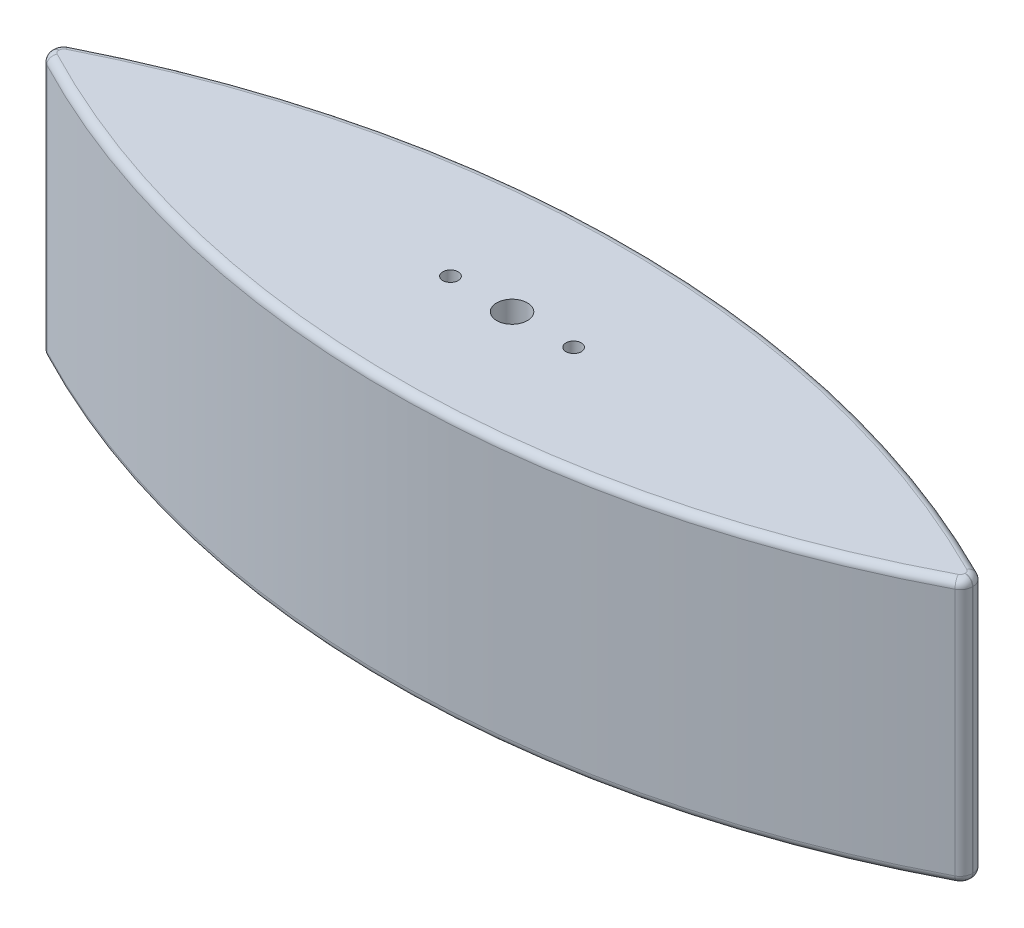
ISO-10303-21;
HEADER;
FILE_DESCRIPTION(('STEP AP214'),'2;1');
FILE_NAME('part.step','',(''),(''),'','','');
FILE_SCHEMA(('AUTOMOTIVE_DESIGN { 1 0 10303 214 1 1 1 1 }'));
ENDSEC;
DATA;
#1=APPLICATION_CONTEXT('core data for automotive mechanical design processes');
#2=APPLICATION_PROTOCOL_DEFINITION('international standard','automotive_design',2000,#1);
#3=PRODUCT_CONTEXT('',#1,'mechanical');
#4=PRODUCT('Part','Part','',(#3));
#5=PRODUCT_RELATED_PRODUCT_CATEGORY('part','',(#4));
#6=PRODUCT_DEFINITION_FORMATION('','',#4);
#7=PRODUCT_DEFINITION_CONTEXT('part definition',#1,'design');
#8=PRODUCT_DEFINITION('design','',#6,#7);
#9=PRODUCT_DEFINITION_SHAPE('','',#8);
#10=(LENGTH_UNIT() NAMED_UNIT(*) SI_UNIT(.MILLI.,.METRE.));
#11=(NAMED_UNIT(*) PLANE_ANGLE_UNIT() SI_UNIT($,.RADIAN.));
#12=(NAMED_UNIT(*) SI_UNIT($,.STERADIAN.) SOLID_ANGLE_UNIT());
#13=UNCERTAINTY_MEASURE_WITH_UNIT(LENGTH_MEASURE(1.E-05),#10,'distance_accuracy_value','');
#14=(GEOMETRIC_REPRESENTATION_CONTEXT(3) GLOBAL_UNCERTAINTY_ASSIGNED_CONTEXT((#13)) GLOBAL_UNIT_ASSIGNED_CONTEXT((#10,
#11,#12)) REPRESENTATION_CONTEXT('',''));
#15=CARTESIAN_POINT('',(0.,0.,0.));
#16=DIRECTION('',(0.,0.,1.));
#17=DIRECTION('',(1.,0.,0.));
#18=AXIS2_PLACEMENT_3D('',#15,#16,#17);
#19=CARTESIAN_POINT('',(0.,165.143069561917,-28.575));
#20=DIRECTION('',(-1.,0.,0.));
#21=DIRECTION('',(0.,0.,1.));
#22=AXIS2_PLACEMENT_3D('',#19,#20,#21);
#23=PLANE('',#22);
#24=DIRECTION('',(0.,1.,0.));
#25=VECTOR('',#24,1.);
#26=CARTESIAN_POINT('',(0.,165.143069561917,-0.0274618653671177));
#27=LINE('',#26,#25);
#28=CARTESIAN_POINT('',(0.,217.939571839068,-0.0274618653671177));
#29=VERTEX_POINT('',#28);
#30=CARTESIAN_POINT('',(0.,166.730569561916,-0.0274618653671177));
#31=VERTEX_POINT('',#30);
#32=EDGE_CURVE('E175',#29,#31,#27,.F.);
#33=ORIENTED_EDGE('',*,*,#32,.T.);
#34=DIRECTION('',(0.,0.,1.));
#35=VECTOR('',#34,1.);
#36=CARTESIAN_POINT('',(0.,166.730569561916,-28.575));
#37=LINE('',#36,#35);
#38=CARTESIAN_POINT('',(0.,166.730569561916,0.0551432731966117));
#39=VERTEX_POINT('',#38);
#40=EDGE_CURVE('E201',#31,#39,#37,.T.);
#41=ORIENTED_EDGE('',*,*,#40,.T.);
#42=DIRECTION('',(0.,1.,0.));
#43=VECTOR('',#42,1.);
#44=CARTESIAN_POINT('',(0.,165.143069561917,0.0551432731966117));
#45=LINE('',#44,#43);
#46=CARTESIAN_POINT('',(0.,217.939571839068,0.0551432731966117));
#47=VERTEX_POINT('',#46);
#48=EDGE_CURVE('E178',#39,#47,#45,.T.);
#49=ORIENTED_EDGE('',*,*,#48,.T.);
#50=DIRECTION('',(0.,0.,1.));
#51=VECTOR('',#50,1.);
#52=CARTESIAN_POINT('',(0.,217.939571839068,-28.575));
#53=LINE('',#52,#51);
#54=EDGE_CURVE('E199',#47,#29,#53,.F.);
#55=ORIENTED_EDGE('',*,*,#54,.T.);
#56=EDGE_LOOP('',(#33,#41,#49,#55));
#57=FACE_BOUND('',#56,.T.);
#58=ADVANCED_FACE('F35',(#57),#23,.T.);
#59=CARTESIAN_POINT('',(0.,219.527071839068,-28.575));
#60=DIRECTION('',(0.,1.,0.));
#61=DIRECTION('',(0.,0.,1.));
#62=AXIS2_PLACEMENT_3D('',#59,#60,#61);
#63=PLANE('',#62);
#64=CARTESIAN_POINT('',(82.3249515817493,219.527071839068,0.));
#65=DIRECTION('',(0.,1.,0.));
#66=DIRECTION('',(0.,0.,1.));
#67=AXIS2_PLACEMENT_3D('',#64,#65,#66);
#68=CIRCLE('',#67,1.5875);
#69=CARTESIAN_POINT('',(82.3249515817493,219.527071839068,1.58749999999999));
#70=VERTEX_POINT('',#69);
#71=EDGE_CURVE('E684',#70,#70,#68,.T.);
#72=ORIENTED_EDGE('',*,*,#71,.F.);
#73=EDGE_LOOP('',(#72));
#74=FACE_BOUND('',#73,.T.);
#75=CARTESIAN_POINT('',(107.724951581749,219.527071839068,0.));
#76=DIRECTION('',(0.,1.,0.));
#77=DIRECTION('',(0.,0.,1.));
#78=AXIS2_PLACEMENT_3D('',#75,#76,#77);
#79=CIRCLE('',#78,1.5875);
#80=CARTESIAN_POINT('',(107.724951581749,219.527071839068,1.58749999999999));
#81=VERTEX_POINT('',#80);
#82=EDGE_CURVE('E693',#81,#81,#79,.T.);
#83=ORIENTED_EDGE('',*,*,#82,.F.);
#84=EDGE_LOOP('',(#83));
#85=FACE_BOUND('',#84,.T.);
#86=DIRECTION('',(0.,0.,1.));
#87=VECTOR('',#86,1.);
#88=CARTESIAN_POINT('',(1.5875,219.527071839068,-28.575));
#89=LINE('',#88,#87);
#90=CARTESIAN_POINT('',(1.5875,219.527071839068,-0.0274618653671177));
#91=VERTEX_POINT('',#90);
#92=CARTESIAN_POINT('',(1.5875,219.527071839068,0.0551432731966117));
#93=VERTEX_POINT('',#92);
#94=EDGE_CURVE('E52',#91,#93,#89,.T.);
#95=ORIENTED_EDGE('',*,*,#94,.T.);
#96=CARTESIAN_POINT('',(2.54,219.527071839068,0.0551432731966117));
#97=DIRECTION('',(0.,1.,0.));
#98=DIRECTION('',(0.,0.,1.));
#99=AXIS2_PLACEMENT_3D('',#96,#97,#98);
#100=CIRCLE('',#99,0.9525);
#101=CARTESIAN_POINT('',(2.09905482923774,219.527071839068,0.899432090119732));
#102=VERTEX_POINT('',#101);
#103=EDGE_CURVE('E234',#93,#102,#100,.T.);
#104=ORIENTED_EDGE('',*,*,#103,.T.);
#105=CARTESIAN_POINT('',(95.0249515817493,219.527071839068,-177.028121340325));
#106=DIRECTION('',(0.,1.,0.));
#107=DIRECTION('',(0.,0.,1.));
#108=AXIS2_PLACEMENT_3D('',#105,#106,#107);
#109=CIRCLE('',#108,200.732250914003);
#110=CARTESIAN_POINT('',(187.950848334261,219.527071839068,0.899432090119741));
#111=VERTEX_POINT('',#110);
#112=EDGE_CURVE('E222',#102,#111,#109,.T.);
#113=ORIENTED_EDGE('',*,*,#112,.T.);
#114=CARTESIAN_POINT('',(187.509903163499,219.527071839068,0.0551432731966117));
#115=DIRECTION('',(0.,1.,0.));
#116=DIRECTION('',(0.,0.,1.));
#117=AXIS2_PLACEMENT_3D('',#114,#115,#116);
#118=CIRCLE('',#117,0.9525);
#119=CARTESIAN_POINT('',(188.462403163499,219.527071839068,0.0551432731966117));
#120=VERTEX_POINT('',#119);
#121=EDGE_CURVE('E224',#111,#120,#118,.T.);
#122=ORIENTED_EDGE('',*,*,#121,.T.);
#123=DIRECTION('',(0.,0.,1.));
#124=VECTOR('',#123,1.);
#125=CARTESIAN_POINT('',(188.462403163499,219.527071839068,-28.575));
#126=LINE('',#125,#124);
#127=CARTESIAN_POINT('',(188.462403163499,219.527071839068,-0.0274618653671177));
#128=VERTEX_POINT('',#127);
#129=EDGE_CURVE('E226',#120,#128,#126,.F.);
#130=ORIENTED_EDGE('',*,*,#129,.T.);
#131=CARTESIAN_POINT('',(187.509903163499,219.527071839068,-0.0274618653671177));
#132=DIRECTION('',(0.,1.,0.));
#133=DIRECTION('',(0.,0.,1.));
#134=AXIS2_PLACEMENT_3D('',#131,#132,#133);
#135=CIRCLE('',#134,0.9525);
#136=CARTESIAN_POINT('',(187.93740809999,219.527071839068,-0.878635043560588));
#137=VERTEX_POINT('',#136);
#138=EDGE_CURVE('E228',#128,#137,#135,.T.);
#139=ORIENTED_EDGE('',*,*,#138,.T.);
#140=CARTESIAN_POINT('',(95.0249515817493,219.527071839068,184.11242390785));
#141=DIRECTION('',(0.,1.,0.));
#142=DIRECTION('',(0.,0.,1.));
#143=AXIS2_PLACEMENT_3D('',#140,#141,#142);
#144=CIRCLE('',#143,207.013082843134);
#145=CARTESIAN_POINT('',(2.11249506350918,219.527071839068,-0.87863504356059));
#146=VERTEX_POINT('',#145);
#147=EDGE_CURVE('E230',#137,#146,#144,.T.);
#148=ORIENTED_EDGE('',*,*,#147,.T.);
#149=CARTESIAN_POINT('',(2.54,219.527071839068,-0.0274618653671177));
#150=DIRECTION('',(0.,1.,0.));
#151=DIRECTION('',(0.,0.,1.));
#152=AXIS2_PLACEMENT_3D('',#149,#150,#151);
#153=CIRCLE('',#152,0.9525);
#154=EDGE_CURVE('E57',#146,#91,#153,.T.);
#155=ORIENTED_EDGE('',*,*,#154,.T.);
#156=EDGE_LOOP('',(#95,#104,#113,#122,#130,#139,#148,#155));
#157=FACE_BOUND('',#156,.T.);
#158=CARTESIAN_POINT('',(95.0249515817493,219.527071839068,0.));
#159=DIRECTION('',(0.,1.,0.));
#160=DIRECTION('',(0.,0.,1.));
#161=AXIS2_PLACEMENT_3D('',#158,#159,#160);
#162=CIRCLE('',#161,3.175);
#163=CARTESIAN_POINT('',(95.0249515817493,219.527071839068,3.17499999999999));
#164=VERTEX_POINT('',#163);
#165=EDGE_CURVE('E252',#164,#164,#162,.T.);
#166=ORIENTED_EDGE('',*,*,#165,.F.);
#167=EDGE_LOOP('',(#166));
#168=FACE_BOUND('',#167,.T.);
#169=ADVANCED_FACE('F357',(#74,#85,#157,#168),#63,.T.);
#170=CARTESIAN_POINT('',(190.049903163499,165.143069561917,-28.575));
#171=DIRECTION('',(1.,0.,0.));
#172=DIRECTION('',(0.,0.,-1.));
#173=AXIS2_PLACEMENT_3D('',#170,#171,#172);
#174=PLANE('',#173);
#175=DIRECTION('',(0.,1.,0.));
#176=VECTOR('',#175,1.);
#177=CARTESIAN_POINT('',(190.049903163499,165.143069561917,0.0551432731966117));
#178=LINE('',#177,#176);
#179=CARTESIAN_POINT('',(190.049903163499,217.939571839068,0.0551432731966117));
#180=VERTEX_POINT('',#179);
#181=CARTESIAN_POINT('',(190.049903163499,166.730569561916,0.0551432731966117));
#182=VERTEX_POINT('',#181);
#183=EDGE_CURVE('E300',#180,#182,#178,.F.);
#184=ORIENTED_EDGE('',*,*,#183,.T.);
#185=DIRECTION('',(0.,0.,1.));
#186=VECTOR('',#185,1.);
#187=CARTESIAN_POINT('',(190.049903163499,166.730569561916,-28.575));
#188=LINE('',#187,#186);
#189=CARTESIAN_POINT('',(190.049903163499,166.730569561916,-0.0274618653671177));
#190=VERTEX_POINT('',#189);
#191=EDGE_CURVE('E217',#182,#190,#188,.F.);
#192=ORIENTED_EDGE('',*,*,#191,.T.);
#193=DIRECTION('',(0.,1.,0.));
#194=VECTOR('',#193,1.);
#195=CARTESIAN_POINT('',(190.049903163499,165.143069561917,-0.0274618653671177));
#196=LINE('',#195,#194);
#197=CARTESIAN_POINT('',(190.049903163499,217.939571839068,-0.0274618653671177));
#198=VERTEX_POINT('',#197);
#199=EDGE_CURVE('E290',#190,#198,#196,.T.);
#200=ORIENTED_EDGE('',*,*,#199,.T.);
#201=DIRECTION('',(0.,0.,1.));
#202=VECTOR('',#201,1.);
#203=CARTESIAN_POINT('',(190.049903163499,217.939571839068,-28.575));
#204=LINE('',#203,#202);
#205=EDGE_CURVE('E215',#198,#180,#204,.T.);
#206=ORIENTED_EDGE('',*,*,#205,.T.);
#207=EDGE_LOOP('',(#184,#192,#200,#206));
#208=FACE_BOUND('',#207,.T.);
#209=ADVANCED_FACE('F296',(#208),#174,.T.);
#210=CARTESIAN_POINT('',(0.,165.143069561917,-28.575));
#211=DIRECTION('',(0.,-1.,0.));
#212=DIRECTION('',(0.,0.,-1.));
#213=AXIS2_PLACEMENT_3D('',#210,#211,#212);
#214=PLANE('',#213);
#215=CARTESIAN_POINT('',(107.724951581749,165.143069561917,0.));
#216=DIRECTION('',(0.,-1.,0.));
#217=DIRECTION('',(0.,0.,-1.));
#218=AXIS2_PLACEMENT_3D('',#215,#216,#217);
#219=CIRCLE('',#218,1.5875);
#220=CARTESIAN_POINT('',(107.724951581749,165.143069561917,-1.58750000000001));
#221=VERTEX_POINT('',#220);
#222=EDGE_CURVE('E675',#221,#221,#219,.T.);
#223=ORIENTED_EDGE('',*,*,#222,.F.);
#224=EDGE_LOOP('',(#223));
#225=FACE_BOUND('',#224,.T.);
#226=CARTESIAN_POINT('',(82.3249515817493,165.143069561917,0.));
#227=DIRECTION('',(0.,-1.,0.));
#228=DIRECTION('',(0.,0.,-1.));
#229=AXIS2_PLACEMENT_3D('',#226,#227,#228);
#230=CIRCLE('',#229,1.5875);
#231=CARTESIAN_POINT('',(82.3249515817493,165.143069561917,-1.58750000000001));
#232=VERTEX_POINT('',#231);
#233=EDGE_CURVE('E678',#232,#232,#230,.T.);
#234=ORIENTED_EDGE('',*,*,#233,.F.);
#235=EDGE_LOOP('',(#234));
#236=FACE_BOUND('',#235,.T.);
#237=CARTESIAN_POINT('',(95.0249515817493,165.143069561917,-177.028121340325));
#238=DIRECTION('',(0.,-1.,0.));
#239=DIRECTION('',(0.,0.,-1.));
#240=AXIS2_PLACEMENT_3D('',#237,#238,#239);
#241=CIRCLE('',#240,200.732250914003);
#242=CARTESIAN_POINT('',(187.950848334261,165.143069561917,0.899432090119741));
#243=VERTEX_POINT('',#242);
#244=CARTESIAN_POINT('',(2.09905482923774,165.143069561917,0.899432090119732));
#245=VERTEX_POINT('',#244);
#246=EDGE_CURVE('E154',#243,#245,#241,.T.);
#247=ORIENTED_EDGE('',*,*,#246,.T.);
#248=CARTESIAN_POINT('',(2.54,165.143069561917,0.0551432731966117));
#249=DIRECTION('',(0.,-1.,0.));
#250=DIRECTION('',(0.,0.,-1.));
#251=AXIS2_PLACEMENT_3D('',#248,#249,#250);
#252=CIRCLE('',#251,0.9525);
#253=CARTESIAN_POINT('',(1.5875,165.143069561917,0.0551432731966117));
#254=VERTEX_POINT('',#253);
#255=EDGE_CURVE('E191',#245,#254,#252,.T.);
#256=ORIENTED_EDGE('',*,*,#255,.T.);
#257=DIRECTION('',(0.,0.,1.));
#258=VECTOR('',#257,1.);
#259=CARTESIAN_POINT('',(1.5875,165.143069561917,-28.575));
#260=LINE('',#259,#258);
#261=CARTESIAN_POINT('',(1.5875,165.143069561917,-0.0274618653671177));
#262=VERTEX_POINT('',#261);
#263=EDGE_CURVE('E189',#254,#262,#260,.F.);
#264=ORIENTED_EDGE('',*,*,#263,.T.);
#265=CARTESIAN_POINT('',(2.54,165.143069561917,-0.0274618653671177));
#266=DIRECTION('',(0.,-1.,0.));
#267=DIRECTION('',(0.,0.,-1.));
#268=AXIS2_PLACEMENT_3D('',#265,#266,#267);
#269=CIRCLE('',#268,0.9525);
#270=CARTESIAN_POINT('',(2.11249506350918,165.143069561917,-0.87863504356059));
#271=VERTEX_POINT('',#270);
#272=EDGE_CURVE('E187',#262,#271,#269,.T.);
#273=ORIENTED_EDGE('',*,*,#272,.T.);
#274=CARTESIAN_POINT('',(95.0249515817493,165.143069561917,184.11242390785));
#275=DIRECTION('',(0.,-1.,0.));
#276=DIRECTION('',(0.,0.,-1.));
#277=AXIS2_PLACEMENT_3D('',#274,#275,#276);
#278=CIRCLE('',#277,207.013082843134);
#279=CARTESIAN_POINT('',(187.93740809999,165.143069561917,-0.878635043560588));
#280=VERTEX_POINT('',#279);
#281=EDGE_CURVE('E185',#271,#280,#278,.T.);
#282=ORIENTED_EDGE('',*,*,#281,.T.);
#283=CARTESIAN_POINT('',(187.509903163499,165.143069561917,-0.0274618653671177));
#284=DIRECTION('',(0.,-1.,0.));
#285=DIRECTION('',(0.,0.,-1.));
#286=AXIS2_PLACEMENT_3D('',#283,#284,#285);
#287=CIRCLE('',#286,0.9525);
#288=CARTESIAN_POINT('',(188.462403163499,165.143069561917,-0.0274618653671177));
#289=VERTEX_POINT('',#288);
#290=EDGE_CURVE('E183',#280,#289,#287,.T.);
#291=ORIENTED_EDGE('',*,*,#290,.T.);
#292=DIRECTION('',(0.,0.,1.));
#293=VECTOR('',#292,1.);
#294=CARTESIAN_POINT('',(188.462403163499,165.143069561917,-28.575));
#295=LINE('',#294,#293);
#296=CARTESIAN_POINT('',(188.462403163499,165.143069561917,0.0551432731966117));
#297=VERTEX_POINT('',#296);
#298=EDGE_CURVE('E157',#289,#297,#295,.T.);
#299=ORIENTED_EDGE('',*,*,#298,.T.);
#300=CARTESIAN_POINT('',(187.509903163499,165.143069561917,0.0551432731966117));
#301=DIRECTION('',(0.,-1.,0.));
#302=DIRECTION('',(0.,0.,-1.));
#303=AXIS2_PLACEMENT_3D('',#300,#301,#302);
#304=CIRCLE('',#303,0.9525);
#305=EDGE_CURVE('E148',#297,#243,#304,.T.);
#306=ORIENTED_EDGE('',*,*,#305,.T.);
#307=EDGE_LOOP('',(#247,#256,#264,#273,#282,#291,#299,#306));
#308=FACE_BOUND('',#307,.T.);
#309=CARTESIAN_POINT('',(95.0249515817493,165.143069561917,0.));
#310=DIRECTION('',(0.,1.,0.));
#311=DIRECTION('',(0.,0.,1.));
#312=AXIS2_PLACEMENT_3D('',#309,#310,#311);
#313=CIRCLE('',#312,3.175);
#314=CARTESIAN_POINT('',(95.0249515817493,165.143069561917,3.17499999999999));
#315=VERTEX_POINT('',#314);
#316=EDGE_CURVE('E304',#315,#315,#313,.T.);
#317=ORIENTED_EDGE('',*,*,#316,.T.);
#318=EDGE_LOOP('',(#317));
#319=FACE_BOUND('',#318,.T.);
#320=ADVANCED_FACE('F150',(#225,#236,#308,#319),#214,.T.);
#321=CARTESIAN_POINT('',(95.0249515817493,165.143069561917,-177.028121340325));
#322=DIRECTION('',(0.,1.,0.));
#323=DIRECTION('',(0.,0.,1.));
#324=AXIS2_PLACEMENT_3D('',#321,#322,#323);
#325=CYLINDRICAL_SURFACE('',#324,202.319750914003);
#326=DIRECTION('',(0.,1.,0.));
#327=VECTOR('',#326,1.);
#328=CARTESIAN_POINT('',(1.36414621130064,165.143069561917,2.30658011832494));
#329=LINE('',#328,#327);
#330=CARTESIAN_POINT('',(1.36414621130064,217.939571839068,2.30658011832494));
#331=VERTEX_POINT('',#330);
#332=CARTESIAN_POINT('',(1.36414621130064,166.730569561916,2.30658011832494));
#333=VERTEX_POINT('',#332);
#334=EDGE_CURVE('E309',#331,#333,#329,.F.);
#335=ORIENTED_EDGE('',*,*,#334,.T.);
#336=CARTESIAN_POINT('',(95.0249515817493,166.730569561916,-177.028121340325));
#337=DIRECTION('',(0.,-1.,0.));
#338=DIRECTION('',(0.,0.,-1.));
#339=AXIS2_PLACEMENT_3D('',#336,#337,#338);
#340=CIRCLE('',#339,202.319750914003);
#341=CARTESIAN_POINT('',(188.685756952198,166.730569561916,2.30658011832494));
#342=VERTEX_POINT('',#341);
#343=EDGE_CURVE('E11',#333,#342,#340,.F.);
#344=ORIENTED_EDGE('',*,*,#343,.T.);
#345=DIRECTION('',(0.,1.,0.));
#346=VECTOR('',#345,1.);
#347=CARTESIAN_POINT('',(188.685756952198,165.143069561917,2.30658011832494));
#348=LINE('',#347,#346);
#349=CARTESIAN_POINT('',(188.685756952198,217.939571839068,2.30658011832494));
#350=VERTEX_POINT('',#349);
#351=EDGE_CURVE('E312',#342,#350,#348,.T.);
#352=ORIENTED_EDGE('',*,*,#351,.T.);
#353=CARTESIAN_POINT('',(95.0249515817493,217.939571839068,-177.028121340325));
#354=DIRECTION('',(0.,1.,0.));
#355=DIRECTION('',(0.,0.,1.));
#356=AXIS2_PLACEMENT_3D('',#353,#354,#355);
#357=CIRCLE('',#356,202.319750914003);
#358=EDGE_CURVE('E44',#350,#331,#357,.F.);
#359=ORIENTED_EDGE('',*,*,#358,.T.);
#360=EDGE_LOOP('',(#335,#344,#352,#359));
#361=FACE_BOUND('',#360,.T.);
#362=ADVANCED_FACE('F640',(#361),#325,.T.);
#363=CARTESIAN_POINT('',(95.0249515817493,165.143069561917,184.11242390785));
#364=DIRECTION('',(0.,1.,0.));
#365=DIRECTION('',(0.,0.,1.));
#366=AXIS2_PLACEMENT_3D('',#363,#364,#365);
#367=CYLINDRICAL_SURFACE('',#366,208.600582843134);
#368=DIRECTION('',(0.,1.,0.));
#369=VECTOR('',#368,1.);
#370=CARTESIAN_POINT('',(188.649916327474,165.143069561917,-2.29725700721639));
#371=LINE('',#370,#369);
#372=CARTESIAN_POINT('',(188.649916327474,217.939571839068,-2.29725700721639));
#373=VERTEX_POINT('',#372);
#374=CARTESIAN_POINT('',(188.649916327474,166.730569561916,-2.29725700721639));
#375=VERTEX_POINT('',#374);
#376=EDGE_CURVE('E293',#373,#375,#371,.F.);
#377=ORIENTED_EDGE('',*,*,#376,.T.);
#378=CARTESIAN_POINT('',(95.0249515817493,166.730569561916,184.11242390785));
#379=DIRECTION('',(0.,-1.,0.));
#380=DIRECTION('',(0.,0.,-1.));
#381=AXIS2_PLACEMENT_3D('',#378,#379,#380);
#382=CIRCLE('',#381,208.600582843134);
#383=CARTESIAN_POINT('',(1.39998683602445,166.730569561916,-2.29725700721642));
#384=VERTEX_POINT('',#383);
#385=EDGE_CURVE('E209',#375,#384,#382,.F.);
#386=ORIENTED_EDGE('',*,*,#385,.T.);
#387=DIRECTION('',(0.,1.,0.));
#388=VECTOR('',#387,1.);
#389=CARTESIAN_POINT('',(1.39998683602445,165.143069561917,-2.29725700721642));
#390=LINE('',#389,#388);
#391=CARTESIAN_POINT('',(1.39998683602445,217.939571839068,-2.29725700721642));
#392=VERTEX_POINT('',#391);
#393=EDGE_CURVE('E299',#384,#392,#390,.T.);
#394=ORIENTED_EDGE('',*,*,#393,.T.);
#395=CARTESIAN_POINT('',(95.0249515817493,217.939571839068,184.11242390785));
#396=DIRECTION('',(0.,1.,0.));
#397=DIRECTION('',(0.,0.,1.));
#398=AXIS2_PLACEMENT_3D('',#395,#396,#397);
#399=CIRCLE('',#398,208.600582843134);
#400=EDGE_CURVE('E207',#392,#373,#399,.F.);
#401=ORIENTED_EDGE('',*,*,#400,.T.);
#402=EDGE_LOOP('',(#377,#386,#394,#401));
#403=FACE_BOUND('',#402,.T.);
#404=ADVANCED_FACE('F632',(#403),#367,.T.);
#405=CARTESIAN_POINT('',(95.0249515817493,165.143069561917,0.));
#406=DIRECTION('',(0.,1.,0.));
#407=DIRECTION('',(0.,0.,1.));
#408=AXIS2_PLACEMENT_3D('',#405,#406,#407);
#409=CYLINDRICAL_SURFACE('',#408,3.175);
#410=ORIENTED_EDGE('',*,*,#316,.F.);
#411=EDGE_LOOP('',(#410));
#412=FACE_BOUND('',#411,.T.);
#413=ORIENTED_EDGE('',*,*,#165,.T.);
#414=EDGE_LOOP('',(#413));
#415=FACE_BOUND('',#414,.T.);
#416=ADVANCED_FACE('F372',(#412,#415),#409,.F.);
#417=CARTESIAN_POINT('',(187.509903163499,165.143069561917,-0.0274618653671177));
#418=DIRECTION('',(0.,1.,0.));
#419=DIRECTION('',(0.,0.,1.));
#420=AXIS2_PLACEMENT_3D('',#417,#418,#419);
#421=CYLINDRICAL_SURFACE('',#420,2.54);
#422=ORIENTED_EDGE('',*,*,#199,.F.);
#423=CARTESIAN_POINT('',(187.509903163499,166.730569561916,-0.0274618653671177));
#424=DIRECTION('',(0.,-1.,0.));
#425=DIRECTION('',(0.,0.,-1.));
#426=AXIS2_PLACEMENT_3D('',#423,#424,#425);
#427=CIRCLE('',#426,2.54);
#428=EDGE_CURVE('E213',#190,#375,#427,.F.);
#429=ORIENTED_EDGE('',*,*,#428,.T.);
#430=ORIENTED_EDGE('',*,*,#376,.F.);
#431=CARTESIAN_POINT('',(187.509903163499,217.939571839068,-0.0274618653671177));
#432=DIRECTION('',(0.,1.,0.));
#433=DIRECTION('',(0.,0.,1.));
#434=AXIS2_PLACEMENT_3D('',#431,#432,#433);
#435=CIRCLE('',#434,2.54);
#436=EDGE_CURVE('E211',#373,#198,#435,.F.);
#437=ORIENTED_EDGE('',*,*,#436,.T.);
#438=EDGE_LOOP('',(#422,#429,#430,#437));
#439=FACE_BOUND('',#438,.T.);
#440=ADVANCED_FACE('F289',(#439),#421,.T.);
#441=CARTESIAN_POINT('',(187.509903163499,165.143069561917,0.0551432731966117));
#442=DIRECTION('',(0.,1.,0.));
#443=DIRECTION('',(0.,0.,1.));
#444=AXIS2_PLACEMENT_3D('',#441,#442,#443);
#445=CYLINDRICAL_SURFACE('',#444,2.54);
#446=ORIENTED_EDGE('',*,*,#351,.F.);
#447=CARTESIAN_POINT('',(187.509903163499,166.730569561916,0.0551432731966117));
#448=DIRECTION('',(0.,-1.,0.));
#449=DIRECTION('',(0.,0.,-1.));
#450=AXIS2_PLACEMENT_3D('',#447,#448,#449);
#451=CIRCLE('',#450,2.54);
#452=EDGE_CURVE('E166',#342,#182,#451,.F.);
#453=ORIENTED_EDGE('',*,*,#452,.T.);
#454=ORIENTED_EDGE('',*,*,#183,.F.);
#455=CARTESIAN_POINT('',(187.509903163499,217.939571839068,0.0551432731966117));
#456=DIRECTION('',(0.,1.,0.));
#457=DIRECTION('',(0.,0.,1.));
#458=AXIS2_PLACEMENT_3D('',#455,#456,#457);
#459=CIRCLE('',#458,2.54);
#460=EDGE_CURVE('E219',#180,#350,#459,.F.);
#461=ORIENTED_EDGE('',*,*,#460,.T.);
#462=EDGE_LOOP('',(#446,#453,#454,#461));
#463=FACE_BOUND('',#462,.T.);
#464=ADVANCED_FACE('F371',(#463),#445,.T.);
#465=CARTESIAN_POINT('',(2.54,165.143069561917,-0.0274618653671177));
#466=DIRECTION('',(0.,1.,0.));
#467=DIRECTION('',(0.,0.,1.));
#468=AXIS2_PLACEMENT_3D('',#465,#466,#467);
#469=CYLINDRICAL_SURFACE('',#468,2.54);
#470=ORIENTED_EDGE('',*,*,#393,.F.);
#471=CARTESIAN_POINT('',(2.54,166.730569561916,-0.0274618653671177));
#472=DIRECTION('',(0.,-1.,0.));
#473=DIRECTION('',(0.,0.,-1.));
#474=AXIS2_PLACEMENT_3D('',#471,#472,#473);
#475=CIRCLE('',#474,2.54);
#476=EDGE_CURVE('E205',#384,#31,#475,.F.);
#477=ORIENTED_EDGE('',*,*,#476,.T.);
#478=ORIENTED_EDGE('',*,*,#32,.F.);
#479=CARTESIAN_POINT('',(2.54,217.939571839068,-0.0274618653671177));
#480=DIRECTION('',(0.,1.,0.));
#481=DIRECTION('',(0.,0.,1.));
#482=AXIS2_PLACEMENT_3D('',#479,#480,#481);
#483=CIRCLE('',#482,2.54);
#484=EDGE_CURVE('E203',#29,#392,#483,.F.);
#485=ORIENTED_EDGE('',*,*,#484,.T.);
#486=EDGE_LOOP('',(#470,#477,#478,#485));
#487=FACE_BOUND('',#486,.T.);
#488=ADVANCED_FACE('F375',(#487),#469,.T.);
#489=CARTESIAN_POINT('',(2.54,165.143069561917,0.0551432731966117));
#490=DIRECTION('',(0.,1.,0.));
#491=DIRECTION('',(0.,0.,1.));
#492=AXIS2_PLACEMENT_3D('',#489,#490,#491);
#493=CYLINDRICAL_SURFACE('',#492,2.54);
#494=ORIENTED_EDGE('',*,*,#48,.F.);
#495=CARTESIAN_POINT('',(2.54,166.730569561916,0.0551432731966117));
#496=DIRECTION('',(0.,-1.,0.));
#497=DIRECTION('',(0.,0.,-1.));
#498=AXIS2_PLACEMENT_3D('',#495,#496,#497);
#499=CIRCLE('',#498,2.54);
#500=EDGE_CURVE('E196',#39,#333,#499,.F.);
#501=ORIENTED_EDGE('',*,*,#500,.T.);
#502=ORIENTED_EDGE('',*,*,#334,.F.);
#503=CARTESIAN_POINT('',(2.54,217.939571839068,0.0551432731966117));
#504=DIRECTION('',(0.,1.,0.));
#505=DIRECTION('',(0.,0.,1.));
#506=AXIS2_PLACEMENT_3D('',#503,#504,#505);
#507=CIRCLE('',#506,2.54);
#508=EDGE_CURVE('E193',#331,#47,#507,.F.);
#509=ORIENTED_EDGE('',*,*,#508,.T.);
#510=EDGE_LOOP('',(#494,#501,#502,#509));
#511=FACE_BOUND('',#510,.T.);
#512=ADVANCED_FACE('F322',(#511),#493,.T.);
#513=CARTESIAN_POINT('',(187.509903163499,166.730569561916,-0.0274618653671177));
#514=DIRECTION('',(0.,-1.,0.));
#515=DIRECTION('',(0.,0.,-1.));
#516=AXIS2_PLACEMENT_3D('',#513,#514,#515);
#517=DEGENERATE_TOROIDAL_SURFACE('',#516,0.9525,1.5875,.T.);
#518=CARTESIAN_POINT('',(187.93740809999,166.730569561916,-0.878635043560594));
#519=DIRECTION('',(-0.893620134586325,0.,-0.448824080305322));
#520=DIRECTION('',(-0.448824080305322,0.,0.893620134586325));
#521=AXIS2_PLACEMENT_3D('',#518,#519,#520);
#522=CIRCLE('',#521,1.5875);
#523=EDGE_CURVE('E246',#375,#280,#522,.T.);
#524=ORIENTED_EDGE('',*,*,#523,.F.);
#525=ORIENTED_EDGE('',*,*,#428,.F.);
#526=CARTESIAN_POINT('',(188.462403163499,166.730569561916,-0.0274618653671177));
#527=DIRECTION('',(0.,0.,1.));
#528=DIRECTION('',(1.,0.,0.));
#529=AXIS2_PLACEMENT_3D('',#526,#527,#528);
#530=CIRCLE('',#529,1.5875);
#531=EDGE_CURVE('E249',#289,#190,#530,.T.);
#532=ORIENTED_EDGE('',*,*,#531,.F.);
#533=ORIENTED_EDGE('',*,*,#290,.F.);
#534=EDGE_LOOP('',(#524,#525,#532,#533));
#535=FACE_BOUND('',#534,.T.);
#536=ADVANCED_FACE('F345',(#535),#517,.T.);
#537=CARTESIAN_POINT('',(188.462403163499,166.730569561916,-28.575));
#538=DIRECTION('',(0.,0.,1.));
#539=DIRECTION('',(1.,0.,0.));
#540=AXIS2_PLACEMENT_3D('',#537,#538,#539);
#541=CYLINDRICAL_SURFACE('',#540,1.5875);
#542=ORIENTED_EDGE('',*,*,#531,.T.);
#543=ORIENTED_EDGE('',*,*,#191,.F.);
#544=CARTESIAN_POINT('',(188.462403163499,166.730569561916,0.0551432731966117));
#545=DIRECTION('',(0.,0.,1.));
#546=DIRECTION('',(1.,0.,0.));
#547=AXIS2_PLACEMENT_3D('',#544,#545,#546);
#548=CIRCLE('',#547,1.5875);
#549=EDGE_CURVE('E244',#297,#182,#548,.T.);
#550=ORIENTED_EDGE('',*,*,#549,.F.);
#551=ORIENTED_EDGE('',*,*,#298,.F.);
#552=EDGE_LOOP('',(#542,#543,#550,#551));
#553=FACE_BOUND('',#552,.T.);
#554=ADVANCED_FACE('F347',(#553),#541,.T.);
#555=CARTESIAN_POINT('',(95.0249515817493,166.730569561916,184.11242390785));
#556=DIRECTION('',(0.,-1.,0.));
#557=DIRECTION('',(0.,0.,-1.));
#558=AXIS2_PLACEMENT_3D('',#555,#556,#557);
#559=TOROIDAL_SURFACE('',#558,207.013082843134,1.5875);
#560=ORIENTED_EDGE('',*,*,#523,.T.);
#561=ORIENTED_EDGE('',*,*,#281,.F.);
#562=CARTESIAN_POINT('',(2.11249506350918,166.730569561916,-0.878635043560591));
#563=DIRECTION('',(-0.893620134586322,0.,0.448824080305327));
#564=DIRECTION('',(0.448824080305327,0.,0.893620134586323));
#565=AXIS2_PLACEMENT_3D('',#562,#563,#564);
#566=CIRCLE('',#565,1.5875);
#567=EDGE_CURVE('E169',#384,#271,#566,.T.);
#568=ORIENTED_EDGE('',*,*,#567,.F.);
#569=ORIENTED_EDGE('',*,*,#385,.F.);
#570=EDGE_LOOP('',(#560,#561,#568,#569));
#571=FACE_BOUND('',#570,.T.);
#572=ADVANCED_FACE('F340',(#571),#559,.T.);
#573=CARTESIAN_POINT('',(187.509903163499,166.730569561916,0.0551432731966117));
#574=DIRECTION('',(0.,-1.,0.));
#575=DIRECTION('',(0.,0.,-1.));
#576=AXIS2_PLACEMENT_3D('',#573,#574,#575);
#577=DEGENERATE_TOROIDAL_SURFACE('',#576,0.9525,1.5875,.T.);
#578=ORIENTED_EDGE('',*,*,#549,.T.);
#579=ORIENTED_EDGE('',*,*,#452,.F.);
#580=CARTESIAN_POINT('',(187.950848334261,166.730569561916,0.899432090119741));
#581=DIRECTION('',(-0.886392458711938,0.,0.46293456248006));
#582=DIRECTION('',(0.462934562480061,0.,0.886392458711938));
#583=AXIS2_PLACEMENT_3D('',#580,#581,#582);
#584=CIRCLE('',#583,1.5875);
#585=EDGE_CURVE('E164',#243,#342,#584,.T.);
#586=ORIENTED_EDGE('',*,*,#585,.F.);
#587=ORIENTED_EDGE('',*,*,#305,.F.);
#588=EDGE_LOOP('',(#578,#579,#586,#587));
#589=FACE_BOUND('',#588,.T.);
#590=ADVANCED_FACE('F165',(#589),#577,.T.);
#591=CARTESIAN_POINT('',(2.54,166.730569561916,-0.0274618653671177));
#592=DIRECTION('',(0.,-1.,0.));
#593=DIRECTION('',(0.,0.,-1.));
#594=AXIS2_PLACEMENT_3D('',#591,#592,#593);
#595=DEGENERATE_TOROIDAL_SURFACE('',#594,0.9525,1.5875,.T.);
#596=ORIENTED_EDGE('',*,*,#567,.T.);
#597=ORIENTED_EDGE('',*,*,#272,.F.);
#598=CARTESIAN_POINT('',(1.5875,166.730569561916,-0.0274618653671177));
#599=DIRECTION('',(0.,0.,1.));
#600=DIRECTION('',(1.,0.,0.));
#601=AXIS2_PLACEMENT_3D('',#598,#599,#600);
#602=CIRCLE('',#601,1.5875);
#603=EDGE_CURVE('E170',#31,#262,#602,.T.);
#604=ORIENTED_EDGE('',*,*,#603,.F.);
#605=ORIENTED_EDGE('',*,*,#476,.F.);
#606=EDGE_LOOP('',(#596,#597,#604,#605));
#607=FACE_BOUND('',#606,.T.);
#608=ADVANCED_FACE('F335',(#607),#595,.T.);
#609=CARTESIAN_POINT('',(95.0249515817493,166.730569561916,-177.028121340325));
#610=DIRECTION('',(0.,-1.,0.));
#611=DIRECTION('',(0.,0.,-1.));
#612=AXIS2_PLACEMENT_3D('',#609,#610,#611);
#613=TOROIDAL_SURFACE('',#612,200.732250914003,1.5875);
#614=ORIENTED_EDGE('',*,*,#585,.T.);
#615=ORIENTED_EDGE('',*,*,#343,.F.);
#616=CARTESIAN_POINT('',(2.09905482923774,166.730569561916,0.899432090119732));
#617=DIRECTION('',(-0.886392458711937,0.,-0.462934562480062));
#618=DIRECTION('',(-0.462934562480062,0.,0.886392458711937));
#619=AXIS2_PLACEMENT_3D('',#616,#617,#618);
#620=CIRCLE('',#619,1.5875);
#621=EDGE_CURVE('E173',#245,#333,#620,.T.);
#622=ORIENTED_EDGE('',*,*,#621,.F.);
#623=ORIENTED_EDGE('',*,*,#246,.F.);
#624=EDGE_LOOP('',(#614,#615,#622,#623));
#625=FACE_BOUND('',#624,.T.);
#626=ADVANCED_FACE('F172',(#625),#613,.T.);
#627=CARTESIAN_POINT('',(1.5875,166.730569561916,-28.575));
#628=DIRECTION('',(0.,0.,1.));
#629=DIRECTION('',(1.,0.,0.));
#630=AXIS2_PLACEMENT_3D('',#627,#628,#629);
#631=CYLINDRICAL_SURFACE('',#630,1.5875);
#632=ORIENTED_EDGE('',*,*,#603,.T.);
#633=ORIENTED_EDGE('',*,*,#263,.F.);
#634=CARTESIAN_POINT('',(1.5875,166.730569561916,0.0551432731966117));
#635=DIRECTION('',(0.,0.,1.));
#636=DIRECTION('',(1.,0.,0.));
#637=AXIS2_PLACEMENT_3D('',#634,#635,#636);
#638=CIRCLE('',#637,1.5875);
#639=EDGE_CURVE('E237',#39,#254,#638,.T.);
#640=ORIENTED_EDGE('',*,*,#639,.F.);
#641=ORIENTED_EDGE('',*,*,#40,.F.);
#642=EDGE_LOOP('',(#632,#633,#640,#641));
#643=FACE_BOUND('',#642,.T.);
#644=ADVANCED_FACE('F330',(#643),#631,.T.);
#645=CARTESIAN_POINT('',(2.54,166.730569561916,0.0551432731966117));
#646=DIRECTION('',(0.,-1.,0.));
#647=DIRECTION('',(0.,0.,-1.));
#648=AXIS2_PLACEMENT_3D('',#645,#646,#647);
#649=DEGENERATE_TOROIDAL_SURFACE('',#648,0.9525,1.5875,.T.);
#650=ORIENTED_EDGE('',*,*,#621,.T.);
#651=ORIENTED_EDGE('',*,*,#500,.F.);
#652=ORIENTED_EDGE('',*,*,#639,.T.);
#653=ORIENTED_EDGE('',*,*,#255,.F.);
#654=EDGE_LOOP('',(#650,#651,#652,#653));
#655=FACE_BOUND('',#654,.T.);
#656=ADVANCED_FACE('F327',(#655),#649,.T.);
#657=CARTESIAN_POINT('',(187.509903163499,217.939571839068,-0.0274618653671177));
#658=DIRECTION('',(0.,1.,0.));
#659=DIRECTION('',(0.,0.,1.));
#660=AXIS2_PLACEMENT_3D('',#657,#658,#659);
#661=DEGENERATE_TOROIDAL_SURFACE('',#660,0.9525,1.5875,.T.);
#662=CARTESIAN_POINT('',(188.462403163499,217.939571839068,-0.0274618653671177));
#663=DIRECTION('',(0.,0.,1.));
#664=DIRECTION('',(1.,0.,0.));
#665=AXIS2_PLACEMENT_3D('',#662,#663,#664);
#666=CIRCLE('',#665,1.5875);
#667=EDGE_CURVE('E269',#198,#128,#666,.T.);
#668=ORIENTED_EDGE('',*,*,#667,.F.);
#669=ORIENTED_EDGE('',*,*,#436,.F.);
#670=CARTESIAN_POINT('',(187.93740809999,217.939571839068,-0.878635043560588));
#671=DIRECTION('',(-0.893620134586326,0.,-0.448824080305321));
#672=DIRECTION('',(-0.448824080305321,0.,0.893620134586326));
#673=AXIS2_PLACEMENT_3D('',#670,#671,#672);
#674=CIRCLE('',#673,1.5875);
#675=EDGE_CURVE('E39',#137,#373,#674,.T.);
#676=ORIENTED_EDGE('',*,*,#675,.F.);
#677=ORIENTED_EDGE('',*,*,#138,.F.);
#678=EDGE_LOOP('',(#668,#669,#676,#677));
#679=FACE_BOUND('',#678,.T.);
#680=ADVANCED_FACE('F37',(#679),#661,.T.);
#681=CARTESIAN_POINT('',(95.0249515817493,217.939571839068,184.11242390785));
#682=DIRECTION('',(0.,1.,0.));
#683=DIRECTION('',(0.,0.,1.));
#684=AXIS2_PLACEMENT_3D('',#681,#682,#683);
#685=TOROIDAL_SURFACE('',#684,207.013082843134,1.5875);
#686=ORIENTED_EDGE('',*,*,#675,.T.);
#687=ORIENTED_EDGE('',*,*,#400,.F.);
#688=CARTESIAN_POINT('',(2.11249506350918,217.939571839068,-0.87863504356059));
#689=DIRECTION('',(-0.893620134586323,0.,0.448824080305327));
#690=DIRECTION('',(0.448824080305327,0.,0.893620134586323));
#691=AXIS2_PLACEMENT_3D('',#688,#689,#690);
#692=CIRCLE('',#691,1.5875);
#693=EDGE_CURVE('E267',#146,#392,#692,.T.);
#694=ORIENTED_EDGE('',*,*,#693,.F.);
#695=ORIENTED_EDGE('',*,*,#147,.F.);
#696=EDGE_LOOP('',(#686,#687,#694,#695));
#697=FACE_BOUND('',#696,.T.);
#698=ADVANCED_FACE('F280',(#697),#685,.T.);
#699=CARTESIAN_POINT('',(188.462403163499,217.939571839068,-28.575));
#700=DIRECTION('',(0.,0.,1.));
#701=DIRECTION('',(1.,0.,0.));
#702=AXIS2_PLACEMENT_3D('',#699,#700,#701);
#703=CYLINDRICAL_SURFACE('',#702,1.5875);
#704=ORIENTED_EDGE('',*,*,#667,.T.);
#705=ORIENTED_EDGE('',*,*,#129,.F.);
#706=CARTESIAN_POINT('',(188.462403163499,217.939571839068,0.0551432731966117));
#707=DIRECTION('',(0.,0.,1.));
#708=DIRECTION('',(1.,0.,0.));
#709=AXIS2_PLACEMENT_3D('',#706,#707,#708);
#710=CIRCLE('',#709,1.5875);
#711=EDGE_CURVE('E264',#180,#120,#710,.T.);
#712=ORIENTED_EDGE('',*,*,#711,.F.);
#713=ORIENTED_EDGE('',*,*,#205,.F.);
#714=EDGE_LOOP('',(#704,#705,#712,#713));
#715=FACE_BOUND('',#714,.T.);
#716=ADVANCED_FACE('F422',(#715),#703,.T.);
#717=CARTESIAN_POINT('',(2.54,217.939571839068,-0.0274618653671177));
#718=DIRECTION('',(0.,1.,0.));
#719=DIRECTION('',(0.,0.,1.));
#720=AXIS2_PLACEMENT_3D('',#717,#718,#719);
#721=DEGENERATE_TOROIDAL_SURFACE('',#720,0.9525,1.5875,.T.);
#722=ORIENTED_EDGE('',*,*,#693,.T.);
#723=ORIENTED_EDGE('',*,*,#484,.F.);
#724=CARTESIAN_POINT('',(1.5875,217.939571839068,-0.0274618653671177));
#725=DIRECTION('',(0.,0.,1.));
#726=DIRECTION('',(1.,0.,0.));
#727=AXIS2_PLACEMENT_3D('',#724,#725,#726);
#728=CIRCLE('',#727,1.5875);
#729=EDGE_CURVE('E261',#91,#29,#728,.T.);
#730=ORIENTED_EDGE('',*,*,#729,.F.);
#731=ORIENTED_EDGE('',*,*,#154,.F.);
#732=EDGE_LOOP('',(#722,#723,#730,#731));
#733=FACE_BOUND('',#732,.T.);
#734=ADVANCED_FACE('F428',(#733),#721,.T.);
#735=CARTESIAN_POINT('',(187.509903163499,217.939571839068,0.0551432731966117));
#736=DIRECTION('',(0.,1.,0.));
#737=DIRECTION('',(0.,0.,1.));
#738=AXIS2_PLACEMENT_3D('',#735,#736,#737);
#739=DEGENERATE_TOROIDAL_SURFACE('',#738,0.9525,1.5875,.T.);
#740=ORIENTED_EDGE('',*,*,#711,.T.);
#741=ORIENTED_EDGE('',*,*,#121,.F.);
#742=CARTESIAN_POINT('',(187.950848334261,217.939571839068,0.899432090119735));
#743=DIRECTION('',(-0.886392458711939,0.,0.462934562480059));
#744=DIRECTION('',(0.462934562480059,0.,0.886392458711939));
#745=AXIS2_PLACEMENT_3D('',#742,#743,#744);
#746=CIRCLE('',#745,1.5875);
#747=EDGE_CURVE('E258',#350,#111,#746,.T.);
#748=ORIENTED_EDGE('',*,*,#747,.F.);
#749=ORIENTED_EDGE('',*,*,#460,.F.);
#750=EDGE_LOOP('',(#740,#741,#748,#749));
#751=FACE_BOUND('',#750,.T.);
#752=ADVANCED_FACE('F435',(#751),#739,.T.);
#753=CARTESIAN_POINT('',(1.5875,217.939571839068,-28.575));
#754=DIRECTION('',(0.,0.,1.));
#755=DIRECTION('',(1.,0.,0.));
#756=AXIS2_PLACEMENT_3D('',#753,#754,#755);
#757=CYLINDRICAL_SURFACE('',#756,1.5875);
#758=ORIENTED_EDGE('',*,*,#729,.T.);
#759=ORIENTED_EDGE('',*,*,#54,.F.);
#760=CARTESIAN_POINT('',(1.5875,217.939571839068,0.0551432731966117));
#761=DIRECTION('',(0.,0.,1.));
#762=DIRECTION('',(1.,0.,0.));
#763=AXIS2_PLACEMENT_3D('',#760,#761,#762);
#764=CIRCLE('',#763,1.5875);
#765=EDGE_CURVE('E255',#93,#47,#764,.T.);
#766=ORIENTED_EDGE('',*,*,#765,.F.);
#767=ORIENTED_EDGE('',*,*,#94,.F.);
#768=EDGE_LOOP('',(#758,#759,#766,#767));
#769=FACE_BOUND('',#768,.T.);
#770=ADVANCED_FACE('F443',(#769),#757,.T.);
#771=CARTESIAN_POINT('',(95.0249515817493,217.939571839068,-177.028121340325));
#772=DIRECTION('',(0.,1.,0.));
#773=DIRECTION('',(0.,0.,1.));
#774=AXIS2_PLACEMENT_3D('',#771,#772,#773);
#775=TOROIDAL_SURFACE('',#774,200.732250914003,1.5875);
#776=ORIENTED_EDGE('',*,*,#747,.T.);
#777=ORIENTED_EDGE('',*,*,#112,.F.);
#778=CARTESIAN_POINT('',(2.09905482923774,217.939571839068,0.89943209011973));
#779=DIRECTION('',(-0.886392458711938,0.,-0.462934562480061));
#780=DIRECTION('',(-0.462934562480061,0.,0.886392458711938));
#781=AXIS2_PLACEMENT_3D('',#778,#779,#780);
#782=CIRCLE('',#781,1.5875);
#783=EDGE_CURVE('E253',#331,#102,#782,.T.);
#784=ORIENTED_EDGE('',*,*,#783,.F.);
#785=ORIENTED_EDGE('',*,*,#358,.F.);
#786=EDGE_LOOP('',(#776,#777,#784,#785));
#787=FACE_BOUND('',#786,.T.);
#788=ADVANCED_FACE('F451',(#787),#775,.T.);
#789=CARTESIAN_POINT('',(2.54,217.939571839068,0.0551432731966117));
#790=DIRECTION('',(0.,1.,0.));
#791=DIRECTION('',(0.,0.,1.));
#792=AXIS2_PLACEMENT_3D('',#789,#790,#791);
#793=DEGENERATE_TOROIDAL_SURFACE('',#792,0.9525,1.5875,.T.);
#794=ORIENTED_EDGE('',*,*,#765,.T.);
#795=ORIENTED_EDGE('',*,*,#508,.F.);
#796=ORIENTED_EDGE('',*,*,#783,.T.);
#797=ORIENTED_EDGE('',*,*,#103,.F.);
#798=EDGE_LOOP('',(#794,#795,#796,#797));
#799=FACE_BOUND('',#798,.T.);
#800=ADVANCED_FACE('F459',(#799),#793,.T.);
#801=CARTESIAN_POINT('',(107.724951581749,206.827071839068,0.));
#802=DIRECTION('',(0.,1.,0.));
#803=DIRECTION('',(0.,0.,1.));
#804=AXIS2_PLACEMENT_3D('',#801,#802,#803);
#805=CYLINDRICAL_SURFACE('',#804,1.5875);
#806=CARTESIAN_POINT('',(107.724951581749,206.827071839068,0.));
#807=DIRECTION('',(0.,1.,0.));
#808=DIRECTION('',(0.,0.,1.));
#809=AXIS2_PLACEMENT_3D('',#806,#807,#808);
#810=CIRCLE('',#809,1.5875);
#811=CARTESIAN_POINT('',(107.724951581749,206.827071839068,1.58749999999999));
#812=VERTEX_POINT('',#811);
#813=EDGE_CURVE('E256',#812,#812,#810,.T.);
#814=ORIENTED_EDGE('',*,*,#813,.F.);
#815=EDGE_LOOP('',(#814));
#816=FACE_BOUND('',#815,.T.);
#817=ORIENTED_EDGE('',*,*,#82,.T.);
#818=EDGE_LOOP('',(#817));
#819=FACE_BOUND('',#818,.T.);
#820=ADVANCED_FACE('F467',(#816,#819),#805,.F.);
#821=CARTESIAN_POINT('',(107.724951581749,206.827071839068,0.));
#822=DIRECTION('',(0.,1.,0.));
#823=DIRECTION('',(0.,0.,1.));
#824=AXIS2_PLACEMENT_3D('',#821,#822,#823);
#825=PLANE('',#824);
#826=ORIENTED_EDGE('',*,*,#813,.T.);
#827=EDGE_LOOP('',(#826));
#828=FACE_BOUND('',#827,.T.);
#829=ADVANCED_FACE('F475',(#828),#825,.T.);
#830=CARTESIAN_POINT('',(82.3249515817493,206.827071839068,0.));
#831=DIRECTION('',(0.,1.,0.));
#832=DIRECTION('',(0.,0.,1.));
#833=AXIS2_PLACEMENT_3D('',#830,#831,#832);
#834=CYLINDRICAL_SURFACE('',#833,1.5875);
#835=CARTESIAN_POINT('',(82.3249515817493,206.827071839068,0.));
#836=DIRECTION('',(0.,1.,0.));
#837=DIRECTION('',(0.,0.,1.));
#838=AXIS2_PLACEMENT_3D('',#835,#836,#837);
#839=CIRCLE('',#838,1.5875);
#840=CARTESIAN_POINT('',(82.3249515817493,206.827071839068,1.58749999999999));
#841=VERTEX_POINT('',#840);
#842=EDGE_CURVE('E690',#841,#841,#839,.T.);
#843=ORIENTED_EDGE('',*,*,#842,.F.);
#844=EDGE_LOOP('',(#843));
#845=FACE_BOUND('',#844,.T.);
#846=ORIENTED_EDGE('',*,*,#71,.T.);
#847=EDGE_LOOP('',(#846));
#848=FACE_BOUND('',#847,.T.);
#849=ADVANCED_FACE('F483',(#845,#848),#834,.F.);
#850=CARTESIAN_POINT('',(82.3249515817493,206.827071839068,0.));
#851=DIRECTION('',(0.,1.,0.));
#852=DIRECTION('',(0.,0.,1.));
#853=AXIS2_PLACEMENT_3D('',#850,#851,#852);
#854=PLANE('',#853);
#855=ORIENTED_EDGE('',*,*,#842,.T.);
#856=EDGE_LOOP('',(#855));
#857=FACE_BOUND('',#856,.T.);
#858=ADVANCED_FACE('F491',(#857),#854,.T.);
#859=CARTESIAN_POINT('',(82.3249515817493,177.843069561917,0.));
#860=DIRECTION('',(0.,-1.,0.));
#861=DIRECTION('',(0.,0.,-1.));
#862=AXIS2_PLACEMENT_3D('',#859,#860,#861);
#863=CYLINDRICAL_SURFACE('',#862,1.5875);
#864=CARTESIAN_POINT('',(82.3249515817493,177.843069561917,0.));
#865=DIRECTION('',(0.,-1.,0.));
#866=DIRECTION('',(0.,0.,-1.));
#867=AXIS2_PLACEMENT_3D('',#864,#865,#866);
#868=CIRCLE('',#867,1.5875);
#869=CARTESIAN_POINT('',(82.3249515817493,177.843069561917,-1.58750000000001));
#870=VERTEX_POINT('',#869);
#871=EDGE_CURVE('E680',#870,#870,#868,.T.);
#872=ORIENTED_EDGE('',*,*,#871,.F.);
#873=EDGE_LOOP('',(#872));
#874=FACE_BOUND('',#873,.T.);
#875=ORIENTED_EDGE('',*,*,#233,.T.);
#876=EDGE_LOOP('',(#875));
#877=FACE_BOUND('',#876,.T.);
#878=ADVANCED_FACE('F499',(#874,#877),#863,.F.);
#879=CARTESIAN_POINT('',(82.3249515817493,177.843069561917,0.));
#880=DIRECTION('',(0.,-1.,0.));
#881=DIRECTION('',(0.,0.,-1.));
#882=AXIS2_PLACEMENT_3D('',#879,#880,#881);
#883=PLANE('',#882);
#884=ORIENTED_EDGE('',*,*,#871,.T.);
#885=EDGE_LOOP('',(#884));
#886=FACE_BOUND('',#885,.T.);
#887=ADVANCED_FACE('F508',(#886),#883,.T.);
#888=CARTESIAN_POINT('',(107.724951581749,177.843069561917,0.));
#889=DIRECTION('',(0.,-1.,0.));
#890=DIRECTION('',(0.,0.,-1.));
#891=AXIS2_PLACEMENT_3D('',#888,#889,#890);
#892=CYLINDRICAL_SURFACE('',#891,1.5875);
#893=CARTESIAN_POINT('',(107.724951581749,177.843069561917,0.));
#894=DIRECTION('',(0.,-1.,0.));
#895=DIRECTION('',(0.,0.,-1.));
#896=AXIS2_PLACEMENT_3D('',#893,#894,#895);
#897=CIRCLE('',#896,1.5875);
#898=CARTESIAN_POINT('',(107.724951581749,177.843069561917,-1.58750000000001));
#899=VERTEX_POINT('',#898);
#900=EDGE_CURVE('E681',#899,#899,#897,.T.);
#901=ORIENTED_EDGE('',*,*,#900,.F.);
#902=EDGE_LOOP('',(#901));
#903=FACE_BOUND('',#902,.T.);
#904=ORIENTED_EDGE('',*,*,#222,.T.);
#905=EDGE_LOOP('',(#904));
#906=FACE_BOUND('',#905,.T.);
#907=ADVANCED_FACE('F516',(#903,#906),#892,.F.);
#908=CARTESIAN_POINT('',(107.724951581749,177.843069561917,0.));
#909=DIRECTION('',(0.,-1.,0.));
#910=DIRECTION('',(0.,0.,-1.));
#911=AXIS2_PLACEMENT_3D('',#908,#909,#910);
#912=PLANE('',#911);
#913=ORIENTED_EDGE('',*,*,#900,.T.);
#914=EDGE_LOOP('',(#913));
#915=FACE_BOUND('',#914,.T.);
#916=ADVANCED_FACE('F524',(#915),#912,.T.);
#917=CLOSED_SHELL('',(#58,#169,#209,#320,#362,#404,#416,#440,#464,#488,#512,#536,#554,#572,#590,
#608,#626,#644,#656,#680,#698,#716,#734,#752,#770,#788,#800,#820,#829,#849,#858,#878,#887,#907,#916));
#918=MANIFOLD_SOLID_BREP('B2',#917);
#919=ADVANCED_BREP_SHAPE_REPRESENTATION('',(#18,#918),#14);
#920=SHAPE_DEFINITION_REPRESENTATION(#9,#919);
ENDSEC;
END-ISO-10303-21;
